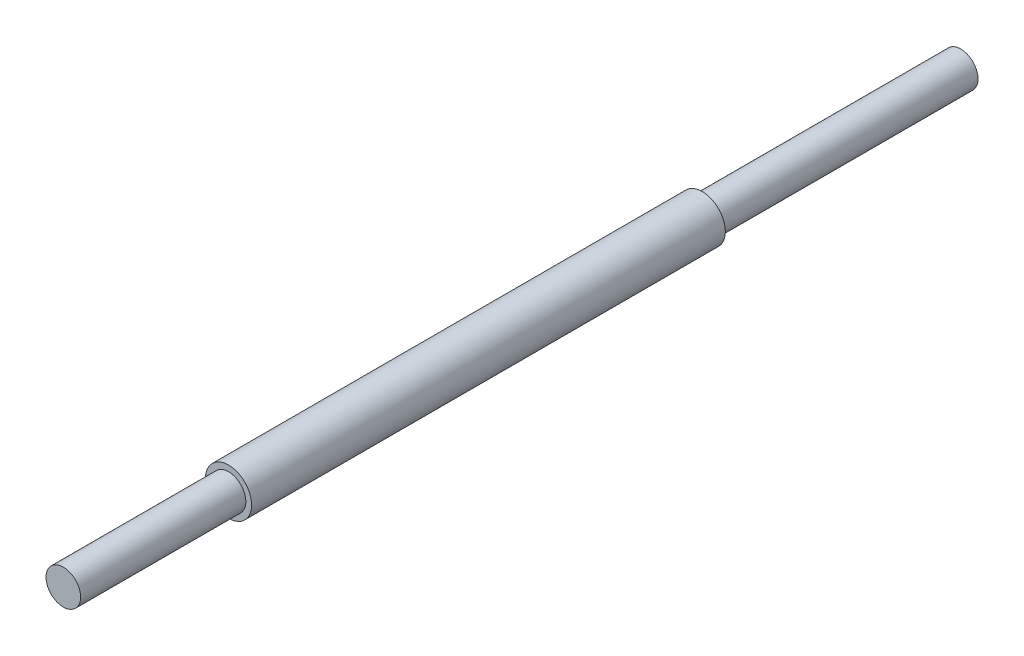
ISO-10303-21;
HEADER;
FILE_DESCRIPTION(('STEP AP214'),'2;1');
FILE_NAME('part.step','',(''),(''),'','','');
FILE_SCHEMA(('AUTOMOTIVE_DESIGN { 1 0 10303 214 1 1 1 1 }'));
ENDSEC;
DATA;
#1=APPLICATION_CONTEXT('core data for automotive mechanical design processes');
#2=APPLICATION_PROTOCOL_DEFINITION('international standard','automotive_design',2000,#1);
#3=PRODUCT_CONTEXT('',#1,'mechanical');
#4=PRODUCT('Part','Part','',(#3));
#5=PRODUCT_RELATED_PRODUCT_CATEGORY('part','',(#4));
#6=PRODUCT_DEFINITION_FORMATION('','',#4);
#7=PRODUCT_DEFINITION_CONTEXT('part definition',#1,'design');
#8=PRODUCT_DEFINITION('design','',#6,#7);
#9=PRODUCT_DEFINITION_SHAPE('','',#8);
#10=(LENGTH_UNIT() NAMED_UNIT(*) SI_UNIT(.MILLI.,.METRE.));
#11=(NAMED_UNIT(*) PLANE_ANGLE_UNIT() SI_UNIT($,.RADIAN.));
#12=(NAMED_UNIT(*) SI_UNIT($,.STERADIAN.) SOLID_ANGLE_UNIT());
#13=UNCERTAINTY_MEASURE_WITH_UNIT(LENGTH_MEASURE(1.E-05),#10,'distance_accuracy_value','');
#14=(GEOMETRIC_REPRESENTATION_CONTEXT(3) GLOBAL_UNCERTAINTY_ASSIGNED_CONTEXT((#13)) GLOBAL_UNIT_ASSIGNED_CONTEXT((#10,
#11,#12)) REPRESENTATION_CONTEXT('',''));
#15=CARTESIAN_POINT('',(0.,0.,0.));
#16=DIRECTION('',(0.,0.,1.));
#17=DIRECTION('',(1.,0.,0.));
#18=AXIS2_PLACEMENT_3D('',#15,#16,#17);
#19=CARTESIAN_POINT('',(0.,0.,130.3528));
#20=DIRECTION('',(0.,0.,-1.));
#21=DIRECTION('',(-1.,0.,0.));
#22=AXIS2_PLACEMENT_3D('',#19,#20,#21);
#23=CYLINDRICAL_SURFACE('',#22,6.35);
#24=CARTESIAN_POINT('',(0.,0.,130.3528));
#25=DIRECTION('',(0.,0.,1.));
#26=DIRECTION('',(1.,0.,0.));
#27=AXIS2_PLACEMENT_3D('',#24,#25,#26);
#28=CIRCLE('',#27,6.35);
#29=CARTESIAN_POINT('',(6.35,0.,130.3528));
#30=VERTEX_POINT('',#29);
#31=EDGE_CURVE('E49',#30,#30,#28,.T.);
#32=ORIENTED_EDGE('',*,*,#31,.F.);
#33=EDGE_LOOP('',(#32));
#34=FACE_BOUND('',#33,.T.);
#35=CARTESIAN_POINT('',(0.,0.,0.));
#36=DIRECTION('',(0.,0.,1.));
#37=DIRECTION('',(1.,0.,0.));
#38=AXIS2_PLACEMENT_3D('',#35,#36,#37);
#39=CIRCLE('',#38,6.35);
#40=CARTESIAN_POINT('',(6.35,0.,0.));
#41=VERTEX_POINT('',#40);
#42=EDGE_CURVE('E40',#41,#41,#39,.T.);
#43=ORIENTED_EDGE('',*,*,#42,.T.);
#44=EDGE_LOOP('',(#43));
#45=FACE_BOUND('',#44,.T.);
#46=ADVANCED_FACE('F37',(#34,#45),#23,.T.);
#47=CARTESIAN_POINT('',(0.,0.,130.3528));
#48=DIRECTION('',(0.,0.,1.));
#49=DIRECTION('',(1.,0.,0.));
#50=AXIS2_PLACEMENT_3D('',#47,#48,#49);
#51=PLANE('',#50);
#52=CARTESIAN_POINT('',(0.,0.,130.3528));
#53=DIRECTION('',(0.,0.,1.));
#54=DIRECTION('',(1.,0.,0.));
#55=AXIS2_PLACEMENT_3D('',#52,#53,#54);
#56=CIRCLE('',#55,4.7625);
#57=CARTESIAN_POINT('',(-4.7625,0.,130.3528));
#58=VERTEX_POINT('',#57);
#59=EDGE_CURVE('E44',#58,#58,#56,.T.);
#60=ORIENTED_EDGE('',*,*,#59,.F.);
#61=EDGE_LOOP('',(#60));
#62=FACE_BOUND('',#61,.T.);
#63=ORIENTED_EDGE('',*,*,#31,.T.);
#64=EDGE_LOOP('',(#63));
#65=FACE_BOUND('',#64,.T.);
#66=ADVANCED_FACE('F66',(#62,#65),#51,.T.);
#67=CARTESIAN_POINT('',(0.,0.,0.));
#68=DIRECTION('',(0.,0.,1.));
#69=DIRECTION('',(1.,0.,0.));
#70=AXIS2_PLACEMENT_3D('',#67,#68,#69);
#71=PLANE('',#70);
#72=CARTESIAN_POINT('',(0.,0.,0.));
#73=DIRECTION('',(0.,0.,-1.));
#74=DIRECTION('',(-1.,0.,0.));
#75=AXIS2_PLACEMENT_3D('',#72,#73,#74);
#76=CIRCLE('',#75,4.7625);
#77=CARTESIAN_POINT('',(-4.7625,0.,0.));
#78=VERTEX_POINT('',#77);
#79=EDGE_CURVE('E10',#78,#78,#76,.T.);
#80=ORIENTED_EDGE('',*,*,#79,.F.);
#81=EDGE_LOOP('',(#80));
#82=FACE_BOUND('',#81,.T.);
#83=ORIENTED_EDGE('',*,*,#42,.F.);
#84=EDGE_LOOP('',(#83));
#85=FACE_BOUND('',#84,.T.);
#86=ADVANCED_FACE('F63',(#82,#85),#71,.F.);
#87=CARTESIAN_POINT('',(0.,0.,175.8188));
#88=DIRECTION('',(0.,0.,-1.));
#89=DIRECTION('',(-1.,0.,0.));
#90=AXIS2_PLACEMENT_3D('',#87,#88,#89);
#91=CYLINDRICAL_SURFACE('',#90,4.7625);
#92=CARTESIAN_POINT('',(0.,0.,175.8188));
#93=DIRECTION('',(0.,0.,1.));
#94=DIRECTION('',(1.,0.,0.));
#95=AXIS2_PLACEMENT_3D('',#92,#93,#94);
#96=CIRCLE('',#95,4.7625);
#97=CARTESIAN_POINT('',(-4.7625,0.,175.8188));
#98=VERTEX_POINT('',#97);
#99=EDGE_CURVE('E54',#98,#98,#96,.T.);
#100=CARTESIAN_POINT('',(-4.7625,0.,175.8188));
#101=CARTESIAN_POINT('',(-4.7625,0.,175.345195833333));
#102=CARTESIAN_POINT('',(-4.7625,0.,174.871591666667));
#103=CARTESIAN_POINT('',(-4.7625,0.,173.924383333333));
#104=CARTESIAN_POINT('',(-4.7625,0.,173.450779166667));
#105=CARTESIAN_POINT('',(-4.7625,0.,172.503570833333));
#106=CARTESIAN_POINT('',(-4.7625,0.,172.029966666667));
#107=CARTESIAN_POINT('',(-4.7625,0.,171.082758333333));
#108=CARTESIAN_POINT('',(-4.7625,0.,170.609154166667));
#109=CARTESIAN_POINT('',(-4.7625,0.,169.661945833333));
#110=CARTESIAN_POINT('',(-4.7625,0.,169.188341666667));
#111=CARTESIAN_POINT('',(-4.7625,0.,168.241133333333));
#112=CARTESIAN_POINT('',(-4.7625,0.,167.767529166667));
#113=CARTESIAN_POINT('',(-4.7625,0.,166.820320833333));
#114=CARTESIAN_POINT('',(-4.7625,0.,166.346716666667));
#115=CARTESIAN_POINT('',(-4.7625,0.,165.399508333333));
#116=CARTESIAN_POINT('',(-4.7625,0.,164.925904166667));
#117=CARTESIAN_POINT('',(-4.7625,0.,163.978695833333));
#118=CARTESIAN_POINT('',(-4.7625,0.,163.505091666667));
#119=CARTESIAN_POINT('',(-4.7625,0.,162.557883333333));
#120=CARTESIAN_POINT('',(-4.7625,0.,162.084279166667));
#121=CARTESIAN_POINT('',(-4.7625,0.,161.137070833333));
#122=CARTESIAN_POINT('',(-4.7625,0.,160.663466666667));
#123=CARTESIAN_POINT('',(-4.7625,0.,159.716258333333));
#124=CARTESIAN_POINT('',(-4.7625,0.,159.242654166667));
#125=CARTESIAN_POINT('',(-4.7625,0.,158.295445833333));
#126=CARTESIAN_POINT('',(-4.7625,0.,157.821841666667));
#127=CARTESIAN_POINT('',(-4.7625,0.,156.874633333333));
#128=CARTESIAN_POINT('',(-4.7625,0.,156.401029166667));
#129=CARTESIAN_POINT('',(-4.7625,0.,155.453820833333));
#130=CARTESIAN_POINT('',(-4.7625,0.,154.980216666667));
#131=CARTESIAN_POINT('',(-4.7625,0.,154.033008333333));
#132=CARTESIAN_POINT('',(-4.7625,0.,153.559404166667));
#133=CARTESIAN_POINT('',(-4.7625,0.,152.612195833333));
#134=CARTESIAN_POINT('',(-4.7625,0.,152.138591666667));
#135=CARTESIAN_POINT('',(-4.7625,0.,151.191383333333));
#136=CARTESIAN_POINT('',(-4.7625,0.,150.717779166667));
#137=CARTESIAN_POINT('',(-4.7625,0.,149.770570833333));
#138=CARTESIAN_POINT('',(-4.7625,0.,149.296966666667));
#139=CARTESIAN_POINT('',(-4.7625,0.,148.349758333333));
#140=CARTESIAN_POINT('',(-4.7625,0.,147.876154166667));
#141=CARTESIAN_POINT('',(-4.7625,0.,146.928945833333));
#142=CARTESIAN_POINT('',(-4.7625,0.,146.455341666667));
#143=CARTESIAN_POINT('',(-4.7625,0.,145.508133333333));
#144=CARTESIAN_POINT('',(-4.7625,0.,145.034529166667));
#145=CARTESIAN_POINT('',(-4.7625,0.,144.087320833333));
#146=CARTESIAN_POINT('',(-4.7625,0.,143.613716666667));
#147=CARTESIAN_POINT('',(-4.7625,0.,142.666508333333));
#148=CARTESIAN_POINT('',(-4.7625,0.,142.192904166667));
#149=CARTESIAN_POINT('',(-4.7625,0.,141.245695833333));
#150=CARTESIAN_POINT('',(-4.7625,0.,140.772091666667));
#151=CARTESIAN_POINT('',(-4.7625,0.,139.824883333333));
#152=CARTESIAN_POINT('',(-4.7625,0.,139.351279166667));
#153=CARTESIAN_POINT('',(-4.7625,0.,138.404070833333));
#154=CARTESIAN_POINT('',(-4.7625,0.,137.930466666667));
#155=CARTESIAN_POINT('',(-4.7625,0.,136.983258333333));
#156=CARTESIAN_POINT('',(-4.7625,0.,136.509654166667));
#157=CARTESIAN_POINT('',(-4.7625,0.,135.562445833333));
#158=CARTESIAN_POINT('',(-4.7625,0.,135.088841666667));
#159=CARTESIAN_POINT('',(-4.7625,0.,134.141633333333));
#160=CARTESIAN_POINT('',(-4.7625,0.,133.668029166667));
#161=CARTESIAN_POINT('',(-4.7625,0.,132.720820833333));
#162=CARTESIAN_POINT('',(-4.7625,0.,132.247216666667));
#163=CARTESIAN_POINT('',(-4.7625,0.,131.300008333333));
#164=CARTESIAN_POINT('',(-4.7625,0.,130.826404166667));
#165=CARTESIAN_POINT('',(-4.7625,0.,130.3528));
#166=B_SPLINE_CURVE_WITH_KNOTS('',3,(#100,#101,#102,#103,#104,#105,#106,#107,#108,#109,#110,
#111,#112,#113,#114,#115,#116,#117,#118,#119,#120,#121,#122,#123,#124,#125,#126,#127,#128,#129,
#130,#131,#132,#133,#134,#135,#136,#137,#138,#139,#140,#141,#142,#143,#144,#145,#146,#147,#148,
#149,#150,#151,#152,#153,#154,#155,#156,#157,#158,#159,#160,#161,#162,#163,#164,#165),
.UNSPECIFIED.,.F.,.F.,(4,2,2,2,2,2,2,2,2,2,2,2,2,2,2,2,2,2,2,2,2,2,2,2,2,2,2,2,2,2,2,2,4),(0.,
1.42081249999998,2.84162499999999,4.26243749999999,5.68324999999997,7.10406249999998,
8.52487499999999,9.94568749999997,11.3665,12.7873125,14.208125,15.6289375,17.04975,18.4705625,
19.891375,21.3121875,22.733,24.1538125,25.574625,26.9954375,28.41625,29.8370625,31.257875,
32.6786875,34.0995,35.5203125,36.941125,38.3619375,39.78275,41.2035625,42.624375,
44.0451874999999,45.466),.UNSPECIFIED.);
#167=EDGE_CURVE('BSEAM65',#98,#58,#166,.T.);
#168=ORIENTED_EDGE('',*,*,#99,.F.);
#169=ORIENTED_EDGE('',*,*,#59,.T.);
#170=ORIENTED_EDGE('',*,*,#167,.T.);
#171=ORIENTED_EDGE('',*,*,#167,.F.);
#172=EDGE_LOOP('',(#168,#170,#169,#171));
#173=FACE_BOUND('',#172,.T.);
#174=ADVANCED_FACE('F65',(#173),#91,.T.);
#175=CARTESIAN_POINT('',(0.,0.,175.8188));
#176=DIRECTION('',(0.,0.,1.));
#177=DIRECTION('',(1.,0.,0.));
#178=AXIS2_PLACEMENT_3D('',#175,#176,#177);
#179=PLANE('',#178);
#180=ORIENTED_EDGE('',*,*,#99,.T.);
#181=EDGE_LOOP('',(#180));
#182=FACE_BOUND('',#181,.T.);
#183=ADVANCED_FACE('F72',(#182),#179,.T.);
#184=CARTESIAN_POINT('',(0.,0.,-71.12));
#185=DIRECTION('',(0.,0.,1.));
#186=DIRECTION('',(1.,0.,0.));
#187=AXIS2_PLACEMENT_3D('',#184,#185,#186);
#188=CYLINDRICAL_SURFACE('',#187,4.7625);
#189=CARTESIAN_POINT('',(0.,0.,-71.12));
#190=DIRECTION('',(0.,0.,-1.));
#191=DIRECTION('',(-1.,0.,0.));
#192=AXIS2_PLACEMENT_3D('',#189,#190,#191);
#193=CIRCLE('',#192,4.7625);
#194=CARTESIAN_POINT('',(-4.7625,0.,-71.12));
#195=VERTEX_POINT('',#194);
#196=EDGE_CURVE('E53',#195,#195,#193,.T.);
#197=ORIENTED_EDGE('',*,*,#196,.F.);
#198=EDGE_LOOP('',(#197));
#199=FACE_BOUND('',#198,.T.);
#200=ORIENTED_EDGE('',*,*,#79,.T.);
#201=EDGE_LOOP('',(#200));
#202=FACE_BOUND('',#201,.T.);
#203=ADVANCED_FACE('F102',(#199,#202),#188,.T.);
#204=CARTESIAN_POINT('',(0.,0.,-71.12));
#205=DIRECTION('',(0.,0.,-1.));
#206=DIRECTION('',(-1.,0.,0.));
#207=AXIS2_PLACEMENT_3D('',#204,#205,#206);
#208=PLANE('',#207);
#209=ORIENTED_EDGE('',*,*,#196,.T.);
#210=EDGE_LOOP('',(#209));
#211=FACE_BOUND('',#210,.T.);
#212=ADVANCED_FACE('F118',(#211),#208,.T.);
#213=CLOSED_SHELL('',(#46,#66,#86,#174,#183,#203,#212));
#214=MANIFOLD_SOLID_BREP('B2',#213);
#215=ADVANCED_BREP_SHAPE_REPRESENTATION('',(#18,#214),#14);
#216=SHAPE_DEFINITION_REPRESENTATION(#9,#215);
ENDSEC;
END-ISO-10303-21;
